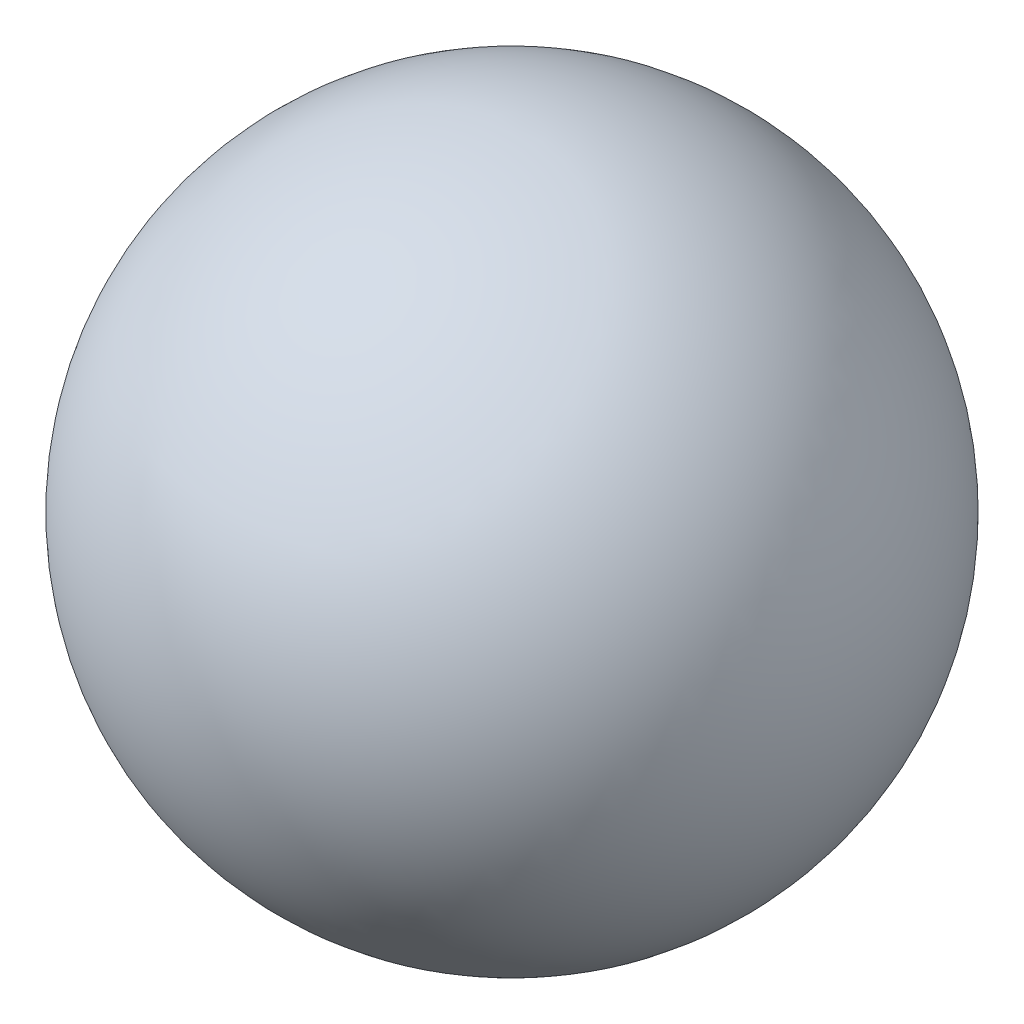
ISO-10303-21;
HEADER;
FILE_DESCRIPTION(('STEP AP214'),'2;1');
FILE_NAME('part.step','',(''),(''),'','','');
FILE_SCHEMA(('AUTOMOTIVE_DESIGN { 1 0 10303 214 1 1 1 1 }'));
ENDSEC;
DATA;
#1=APPLICATION_CONTEXT('core data for automotive mechanical design processes');
#2=APPLICATION_PROTOCOL_DEFINITION('international standard','automotive_design',2000,#1);
#3=PRODUCT_CONTEXT('',#1,'mechanical');
#4=PRODUCT('Part','Part','',(#3));
#5=PRODUCT_RELATED_PRODUCT_CATEGORY('part','',(#4));
#6=PRODUCT_DEFINITION_FORMATION('','',#4);
#7=PRODUCT_DEFINITION_CONTEXT('part definition',#1,'design');
#8=PRODUCT_DEFINITION('design','',#6,#7);
#9=PRODUCT_DEFINITION_SHAPE('','',#8);
#10=(LENGTH_UNIT() NAMED_UNIT(*) SI_UNIT(.MILLI.,.METRE.));
#11=(NAMED_UNIT(*) PLANE_ANGLE_UNIT() SI_UNIT($,.RADIAN.));
#12=(NAMED_UNIT(*) SI_UNIT($,.STERADIAN.) SOLID_ANGLE_UNIT());
#13=UNCERTAINTY_MEASURE_WITH_UNIT(LENGTH_MEASURE(1.E-05),#10,'distance_accuracy_value','');
#14=(GEOMETRIC_REPRESENTATION_CONTEXT(3) GLOBAL_UNCERTAINTY_ASSIGNED_CONTEXT((#13)) GLOBAL_UNIT_ASSIGNED_CONTEXT((#10,
#11,#12)) REPRESENTATION_CONTEXT('',''));
#15=CARTESIAN_POINT('',(0.,0.,0.));
#16=DIRECTION('',(0.,0.,1.));
#17=DIRECTION('',(1.,0.,0.));
#18=AXIS2_PLACEMENT_3D('',#15,#16,#17);
#19=CARTESIAN_POINT('',(0.,0.,0.));
#20=DIRECTION('',(0.,-1.,0.));
#21=DIRECTION('',(-1.,0.,0.));
#22=AXIS2_PLACEMENT_3D('',#19,#20,#21);
#23=SPHERICAL_SURFACE('',#22,95.);
#24=CARTESIAN_POINT('',(0.,-95.,0.));
#25=VERTEX_POINT('',#24);
#26=VERTEX_LOOP('',#25);
#27=FACE_BOUND('',#26,.T.);
#28=ADVANCED_FACE('F45',(#27),#23,.T.);
#29=CLOSED_SHELL('',(#28));
#30=MANIFOLD_SOLID_BREP('B2',#29);
#31=ADVANCED_BREP_SHAPE_REPRESENTATION('',(#18,#30),#14);
#32=SHAPE_DEFINITION_REPRESENTATION(#9,#31);
ENDSEC;
END-ISO-10303-21;
